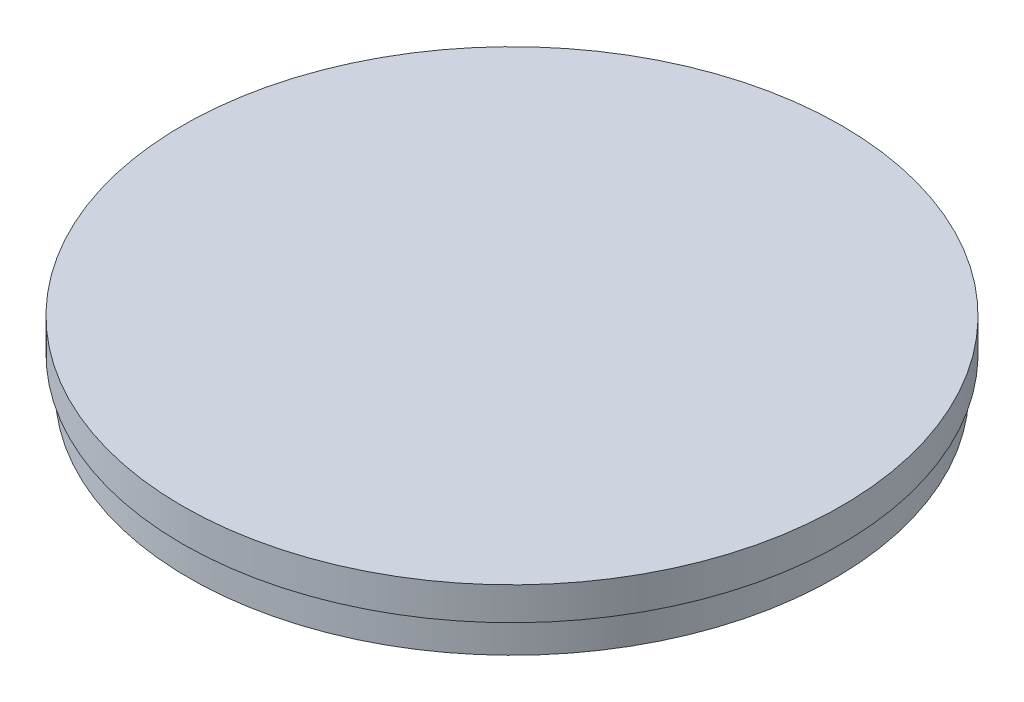
ISO-10303-21;
HEADER;
FILE_DESCRIPTION(('STEP AP214'),'2;1');
FILE_NAME('part.step','',(''),(''),'','','');
FILE_SCHEMA(('AUTOMOTIVE_DESIGN { 1 0 10303 214 1 1 1 1 }'));
ENDSEC;
DATA;
#1=APPLICATION_CONTEXT('core data for automotive mechanical design processes');
#2=APPLICATION_PROTOCOL_DEFINITION('international standard','automotive_design',2000,#1);
#3=PRODUCT_CONTEXT('',#1,'mechanical');
#4=PRODUCT('Part','Part','',(#3));
#5=PRODUCT_RELATED_PRODUCT_CATEGORY('part','',(#4));
#6=PRODUCT_DEFINITION_FORMATION('','',#4);
#7=PRODUCT_DEFINITION_CONTEXT('part definition',#1,'design');
#8=PRODUCT_DEFINITION('design','',#6,#7);
#9=PRODUCT_DEFINITION_SHAPE('','',#8);
#10=(LENGTH_UNIT() NAMED_UNIT(*) SI_UNIT(.MILLI.,.METRE.));
#11=(NAMED_UNIT(*) PLANE_ANGLE_UNIT() SI_UNIT($,.RADIAN.));
#12=(NAMED_UNIT(*) SI_UNIT($,.STERADIAN.) SOLID_ANGLE_UNIT());
#13=UNCERTAINTY_MEASURE_WITH_UNIT(LENGTH_MEASURE(1.E-05),#10,'distance_accuracy_value','');
#14=(GEOMETRIC_REPRESENTATION_CONTEXT(3) GLOBAL_UNCERTAINTY_ASSIGNED_CONTEXT((#13)) GLOBAL_UNIT_ASSIGNED_CONTEXT((#10,
#11,#12)) REPRESENTATION_CONTEXT('',''));
#15=CARTESIAN_POINT('',(0.,0.,0.));
#16=DIRECTION('',(0.,0.,1.));
#17=DIRECTION('',(1.,0.,0.));
#18=AXIS2_PLACEMENT_3D('',#15,#16,#17);
#19=CARTESIAN_POINT('',(0.,0.,0.));
#20=DIRECTION('',(0.,-1.,0.));
#21=DIRECTION('',(0.,0.,-1.));
#22=AXIS2_PLACEMENT_3D('',#19,#20,#21);
#23=PLANE('',#22);
#24=CARTESIAN_POINT('',(0.,0.,0.));
#25=DIRECTION('',(0.,-1.,0.));
#26=DIRECTION('',(0.,0.,-1.));
#27=AXIS2_PLACEMENT_3D('',#24,#25,#26);
#28=CIRCLE('',#27,58.7502);
#29=CARTESIAN_POINT('',(0.,0.,-58.7502));
#30=VERTEX_POINT('',#29);
#31=EDGE_CURVE('E46',#30,#30,#28,.T.);
#32=ORIENTED_EDGE('',*,*,#31,.T.);
#33=EDGE_LOOP('',(#32));
#34=FACE_BOUND('',#33,.T.);
#35=ADVANCED_FACE('F32',(#34),#23,.T.);
#36=CARTESIAN_POINT('',(0.,11.938,0.));
#37=DIRECTION('',(0.,1.,0.));
#38=DIRECTION('',(0.,0.,1.));
#39=AXIS2_PLACEMENT_3D('',#36,#37,#38);
#40=PLANE('',#39);
#41=CARTESIAN_POINT('',(0.,11.938,0.));
#42=DIRECTION('',(0.,-1.,0.));
#43=DIRECTION('',(0.,0.,-1.));
#44=AXIS2_PLACEMENT_3D('',#41,#42,#43);
#45=CIRCLE('',#44,59.944);
#46=CARTESIAN_POINT('',(0.,11.938,-59.944));
#47=VERTEX_POINT('',#46);
#48=EDGE_CURVE('E10',#47,#47,#45,.T.);
#49=ORIENTED_EDGE('',*,*,#48,.F.);
#50=EDGE_LOOP('',(#49));
#51=FACE_BOUND('',#50,.T.);
#52=ADVANCED_FACE('F64',(#51),#40,.T.);
#53=CARTESIAN_POINT('',(0.,0.,0.));
#54=DIRECTION('',(0.,-1.,0.));
#55=DIRECTION('',(0.,0.,-1.));
#56=AXIS2_PLACEMENT_3D('',#53,#54,#55);
#57=CYLINDRICAL_SURFACE('',#56,59.944);
#58=ORIENTED_EDGE('',*,*,#48,.T.);
#59=EDGE_LOOP('',(#58));
#60=FACE_BOUND('',#59,.T.);
#61=CARTESIAN_POINT('',(0.,5.969,0.));
#62=DIRECTION('',(0.,-1.,0.));
#63=DIRECTION('',(0.,0.,-1.));
#64=AXIS2_PLACEMENT_3D('',#61,#62,#63);
#65=CIRCLE('',#64,59.944);
#66=CARTESIAN_POINT('',(0.,5.969,-59.944));
#67=VERTEX_POINT('',#66);
#68=EDGE_CURVE('E38',#67,#67,#65,.T.);
#69=ORIENTED_EDGE('',*,*,#68,.F.);
#70=EDGE_LOOP('',(#69));
#71=FACE_BOUND('',#70,.T.);
#72=ADVANCED_FACE('F61',(#60,#71),#57,.T.);
#73=CARTESIAN_POINT('',(59.944,5.969,0.));
#74=DIRECTION('',(0.,-1.,0.));
#75=DIRECTION('',(0.,0.,-1.));
#76=AXIS2_PLACEMENT_3D('',#73,#74,#75);
#77=PLANE('',#76);
#78=ORIENTED_EDGE('',*,*,#68,.T.);
#79=EDGE_LOOP('',(#78));
#80=FACE_BOUND('',#79,.T.);
#81=CARTESIAN_POINT('',(0.,5.969,0.));
#82=DIRECTION('',(0.,-1.,0.));
#83=DIRECTION('',(0.,0.,-1.));
#84=AXIS2_PLACEMENT_3D('',#81,#82,#83);
#85=CIRCLE('',#84,58.7502);
#86=CARTESIAN_POINT('',(0.,5.969,-58.7502));
#87=VERTEX_POINT('',#86);
#88=EDGE_CURVE('E42',#87,#87,#85,.T.);
#89=ORIENTED_EDGE('',*,*,#88,.F.);
#90=EDGE_LOOP('',(#89));
#91=FACE_BOUND('',#90,.T.);
#92=ADVANCED_FACE('F55',(#80,#91),#77,.T.);
#93=CARTESIAN_POINT('',(0.,0.,0.));
#94=DIRECTION('',(0.,-1.,0.));
#95=DIRECTION('',(0.,0.,-1.));
#96=AXIS2_PLACEMENT_3D('',#93,#94,#95);
#97=CYLINDRICAL_SURFACE('',#96,58.7502);
#98=ORIENTED_EDGE('',*,*,#88,.T.);
#99=EDGE_LOOP('',(#98));
#100=FACE_BOUND('',#99,.T.);
#101=ORIENTED_EDGE('',*,*,#31,.F.);
#102=EDGE_LOOP('',(#101));
#103=FACE_BOUND('',#102,.T.);
#104=ADVANCED_FACE('F53',(#100,#103),#97,.T.);
#105=CLOSED_SHELL('',(#35,#52,#72,#92,#104));
#106=MANIFOLD_SOLID_BREP('B2',#105);
#107=ADVANCED_BREP_SHAPE_REPRESENTATION('',(#18,#106),#14);
#108=SHAPE_DEFINITION_REPRESENTATION(#9,#107);
ENDSEC;
END-ISO-10303-21;
